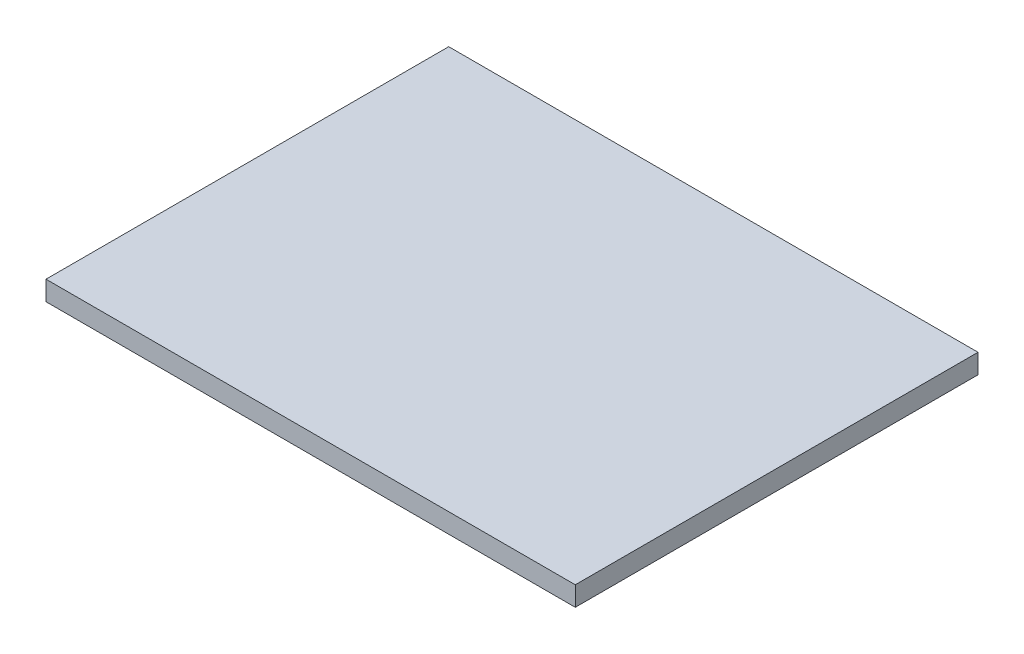
ISO-10303-21;
HEADER;
FILE_DESCRIPTION(('STEP AP214'),'2;1');
FILE_NAME('part.step','',(''),(''),'','','');
FILE_SCHEMA(('AUTOMOTIVE_DESIGN { 1 0 10303 214 1 1 1 1 }'));
ENDSEC;
DATA;
#1=APPLICATION_CONTEXT('core data for automotive mechanical design processes');
#2=APPLICATION_PROTOCOL_DEFINITION('international standard','automotive_design',2000,#1);
#3=PRODUCT_CONTEXT('',#1,'mechanical');
#4=PRODUCT('Part','Part','',(#3));
#5=PRODUCT_RELATED_PRODUCT_CATEGORY('part','',(#4));
#6=PRODUCT_DEFINITION_FORMATION('','',#4);
#7=PRODUCT_DEFINITION_CONTEXT('part definition',#1,'design');
#8=PRODUCT_DEFINITION('design','',#6,#7);
#9=PRODUCT_DEFINITION_SHAPE('','',#8);
#10=(LENGTH_UNIT() NAMED_UNIT(*) SI_UNIT(.MILLI.,.METRE.));
#11=(NAMED_UNIT(*) PLANE_ANGLE_UNIT() SI_UNIT($,.RADIAN.));
#12=(NAMED_UNIT(*) SI_UNIT($,.STERADIAN.) SOLID_ANGLE_UNIT());
#13=UNCERTAINTY_MEASURE_WITH_UNIT(LENGTH_MEASURE(1.E-05),#10,'distance_accuracy_value','');
#14=(GEOMETRIC_REPRESENTATION_CONTEXT(3) GLOBAL_UNCERTAINTY_ASSIGNED_CONTEXT((#13)) GLOBAL_UNIT_ASSIGNED_CONTEXT((#10,
#11,#12)) REPRESENTATION_CONTEXT('',''));
#15=CARTESIAN_POINT('',(0.,0.,0.));
#16=DIRECTION('',(0.,0.,1.));
#17=DIRECTION('',(1.,0.,0.));
#18=AXIS2_PLACEMENT_3D('',#15,#16,#17);
#19=CARTESIAN_POINT('',(0.,2.54,0.));
#20=DIRECTION('',(1.,0.,0.));
#21=DIRECTION('',(0.,0.,-1.));
#22=AXIS2_PLACEMENT_3D('',#19,#20,#21);
#23=PLANE('',#22);
#24=DIRECTION('',(0.,0.,1.));
#25=VECTOR('',#24,1.);
#26=CARTESIAN_POINT('',(0.,0.,0.));
#27=LINE('',#26,#25);
#28=CARTESIAN_POINT('',(0.,0.,-52.3488184476789));
#29=VERTEX_POINT('',#28);
#30=CARTESIAN_POINT('',(0.,0.,0.));
#31=VERTEX_POINT('',#30);
#32=EDGE_CURVE('E96',#29,#31,#27,.T.);
#33=ORIENTED_EDGE('',*,*,#32,.T.);
#34=DIRECTION('',(0.,-1.,0.));
#35=VECTOR('',#34,1.);
#36=CARTESIAN_POINT('',(0.,2.54,0.));
#37=LINE('',#36,#35);
#38=CARTESIAN_POINT('',(0.,2.54,0.));
#39=VERTEX_POINT('',#38);
#40=EDGE_CURVE('E11',#39,#31,#37,.T.);
#41=ORIENTED_EDGE('',*,*,#40,.F.);
#42=DIRECTION('',(0.,0.,1.));
#43=VECTOR('',#42,1.);
#44=CARTESIAN_POINT('',(0.,2.54,0.));
#45=LINE('',#44,#43);
#46=CARTESIAN_POINT('',(0.,2.54,-52.3488184476789));
#47=VERTEX_POINT('',#46);
#48=EDGE_CURVE('E84',#47,#39,#45,.T.);
#49=ORIENTED_EDGE('',*,*,#48,.F.);
#50=DIRECTION('',(0.,-1.,0.));
#51=VECTOR('',#50,1.);
#52=CARTESIAN_POINT('',(0.,2.54,-52.3488184476789));
#53=LINE('',#52,#51);
#54=EDGE_CURVE('E92',#47,#29,#53,.T.);
#55=ORIENTED_EDGE('',*,*,#54,.T.);
#56=EDGE_LOOP('',(#33,#41,#49,#55));
#57=FACE_BOUND('',#56,.T.);
#58=ADVANCED_FACE('F33',(#57),#23,.F.);
#59=CARTESIAN_POINT('',(0.,2.54,0.));
#60=DIRECTION('',(0.,0.,-1.));
#61=DIRECTION('',(-1.,0.,0.));
#62=AXIS2_PLACEMENT_3D('',#59,#60,#61);
#63=PLANE('',#62);
#64=DIRECTION('',(1.,0.,0.));
#65=VECTOR('',#64,1.);
#66=CARTESIAN_POINT('',(0.,0.,0.));
#67=LINE('',#66,#65);
#68=CARTESIAN_POINT('',(68.8013042455209,0.,0.));
#69=VERTEX_POINT('',#68);
#70=EDGE_CURVE('E88',#31,#69,#67,.T.);
#71=ORIENTED_EDGE('',*,*,#70,.T.);
#72=DIRECTION('',(0.,-1.,0.));
#73=VECTOR('',#72,1.);
#74=CARTESIAN_POINT('',(68.8013042455209,2.54,0.));
#75=LINE('',#74,#73);
#76=CARTESIAN_POINT('',(68.8013042455209,2.54,0.));
#77=VERTEX_POINT('',#76);
#78=EDGE_CURVE('E41',#77,#69,#75,.T.);
#79=ORIENTED_EDGE('',*,*,#78,.F.);
#80=DIRECTION('',(1.,0.,0.));
#81=VECTOR('',#80,1.);
#82=CARTESIAN_POINT('',(0.,2.54,0.));
#83=LINE('',#82,#81);
#84=EDGE_CURVE('E79',#39,#77,#83,.T.);
#85=ORIENTED_EDGE('',*,*,#84,.F.);
#86=ORIENTED_EDGE('',*,*,#40,.T.);
#87=EDGE_LOOP('',(#71,#79,#85,#86));
#88=FACE_BOUND('',#87,.T.);
#89=ADVANCED_FACE('F87',(#88),#63,.F.);
#90=CARTESIAN_POINT('',(68.8013042455209,2.54,0.));
#91=DIRECTION('',(-1.,0.,0.));
#92=DIRECTION('',(0.,0.,1.));
#93=AXIS2_PLACEMENT_3D('',#90,#91,#92);
#94=PLANE('',#93);
#95=DIRECTION('',(0.,0.,-1.));
#96=VECTOR('',#95,1.);
#97=CARTESIAN_POINT('',(68.8013042455209,0.,0.));
#98=LINE('',#97,#96);
#99=CARTESIAN_POINT('',(68.8013042455209,0.,-52.3488184476789));
#100=VERTEX_POINT('',#99);
#101=EDGE_CURVE('E66',#69,#100,#98,.T.);
#102=ORIENTED_EDGE('',*,*,#101,.T.);
#103=DIRECTION('',(0.,-1.,0.));
#104=VECTOR('',#103,1.);
#105=CARTESIAN_POINT('',(68.8013042455209,2.54,-52.3488184476789));
#106=LINE('',#105,#104);
#107=CARTESIAN_POINT('',(68.8013042455209,2.54,-52.3488184476789));
#108=VERTEX_POINT('',#107);
#109=EDGE_CURVE('E89',#108,#100,#106,.T.);
#110=ORIENTED_EDGE('',*,*,#109,.F.);
#111=DIRECTION('',(0.,0.,-1.));
#112=VECTOR('',#111,1.);
#113=CARTESIAN_POINT('',(68.8013042455209,2.54,0.));
#114=LINE('',#113,#112);
#115=EDGE_CURVE('E82',#77,#108,#114,.T.);
#116=ORIENTED_EDGE('',*,*,#115,.F.);
#117=ORIENTED_EDGE('',*,*,#78,.T.);
#118=EDGE_LOOP('',(#102,#110,#116,#117));
#119=FACE_BOUND('',#118,.T.);
#120=ADVANCED_FACE('F90',(#119),#94,.F.);
#121=CARTESIAN_POINT('',(0.,2.54,-52.3488184476789));
#122=DIRECTION('',(0.,0.,1.));
#123=DIRECTION('',(1.,0.,0.));
#124=AXIS2_PLACEMENT_3D('',#121,#122,#123);
#125=PLANE('',#124);
#126=DIRECTION('',(-1.,0.,0.));
#127=VECTOR('',#126,1.);
#128=CARTESIAN_POINT('',(0.,0.,-52.3488184476789));
#129=LINE('',#128,#127);
#130=EDGE_CURVE('E72',#100,#29,#129,.T.);
#131=ORIENTED_EDGE('',*,*,#130,.T.);
#132=ORIENTED_EDGE('',*,*,#54,.F.);
#133=DIRECTION('',(-1.,0.,0.));
#134=VECTOR('',#133,1.);
#135=CARTESIAN_POINT('',(0.,2.54,-52.3488184476789));
#136=LINE('',#135,#134);
#137=EDGE_CURVE('E49',#108,#47,#136,.T.);
#138=ORIENTED_EDGE('',*,*,#137,.F.);
#139=ORIENTED_EDGE('',*,*,#109,.T.);
#140=EDGE_LOOP('',(#131,#132,#138,#139));
#141=FACE_BOUND('',#140,.T.);
#142=ADVANCED_FACE('F103',(#141),#125,.F.);
#143=CARTESIAN_POINT('',(0.,2.54,0.));
#144=DIRECTION('',(0.,-1.,0.));
#145=DIRECTION('',(0.,0.,-1.));
#146=AXIS2_PLACEMENT_3D('',#143,#144,#145);
#147=PLANE('',#146);
#148=ORIENTED_EDGE('',*,*,#48,.T.);
#149=ORIENTED_EDGE('',*,*,#84,.T.);
#150=ORIENTED_EDGE('',*,*,#115,.T.);
#151=ORIENTED_EDGE('',*,*,#137,.T.);
#152=EDGE_LOOP('',(#148,#149,#150,#151));
#153=FACE_BOUND('',#152,.T.);
#154=ADVANCED_FACE('F80',(#153),#147,.F.);
#155=CARTESIAN_POINT('',(0.,0.,0.));
#156=DIRECTION('',(0.,-1.,0.));
#157=DIRECTION('',(0.,0.,-1.));
#158=AXIS2_PLACEMENT_3D('',#155,#156,#157);
#159=PLANE('',#158);
#160=ORIENTED_EDGE('',*,*,#32,.F.);
#161=ORIENTED_EDGE('',*,*,#130,.F.);
#162=ORIENTED_EDGE('',*,*,#101,.F.);
#163=ORIENTED_EDGE('',*,*,#70,.F.);
#164=EDGE_LOOP('',(#160,#161,#162,#163));
#165=FACE_BOUND('',#164,.T.);
#166=ADVANCED_FACE('F106',(#165),#159,.T.);
#167=CLOSED_SHELL('',(#58,#89,#120,#142,#154,#166));
#168=MANIFOLD_SOLID_BREP('B2',#167);
#169=ADVANCED_BREP_SHAPE_REPRESENTATION('',(#18,#168),#14);
#170=SHAPE_DEFINITION_REPRESENTATION(#9,#169);
ENDSEC;
END-ISO-10303-21;
